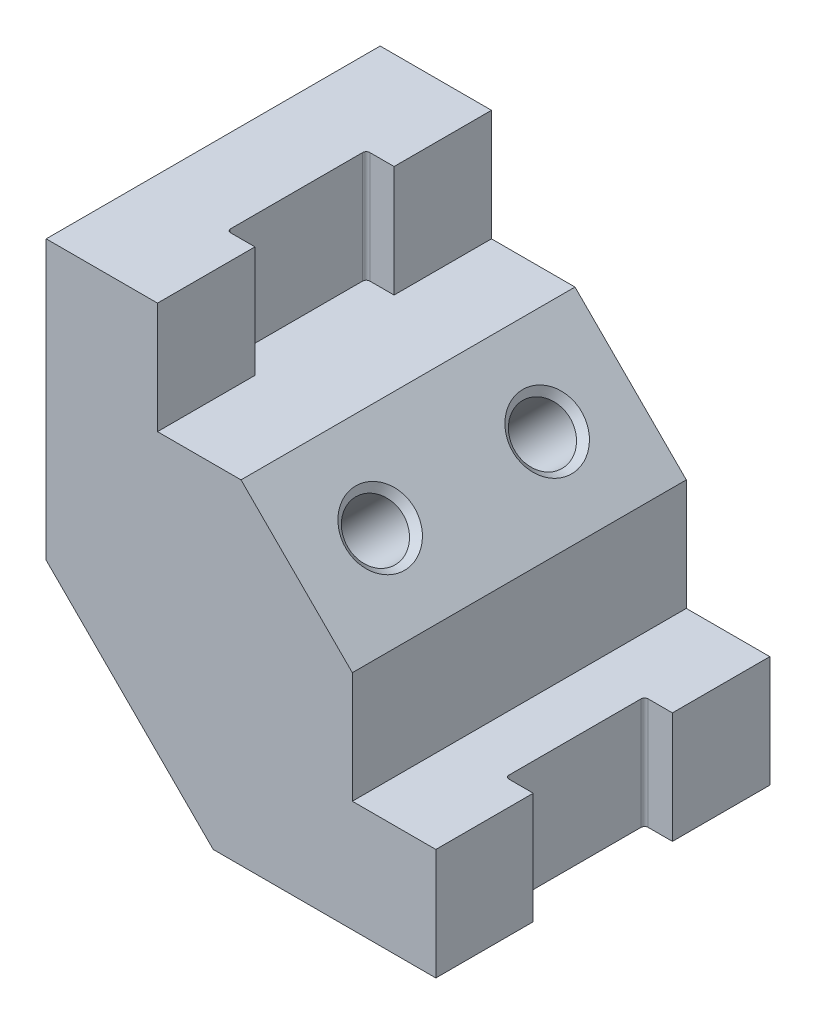
ISO-10303-21;
HEADER;
FILE_DESCRIPTION(('STEP AP214'),'2;1');
FILE_NAME('part.step','',(''),(''),'','','');
FILE_SCHEMA(('AUTOMOTIVE_DESIGN { 1 0 10303 214 1 1 1 1 }'));
ENDSEC;
DATA;
#1=APPLICATION_CONTEXT('core data for automotive mechanical design processes');
#2=APPLICATION_PROTOCOL_DEFINITION('international standard','automotive_design',2000,#1);
#3=PRODUCT_CONTEXT('',#1,'mechanical');
#4=PRODUCT('Part','Part','',(#3));
#5=PRODUCT_RELATED_PRODUCT_CATEGORY('part','',(#4));
#6=PRODUCT_DEFINITION_FORMATION('','',#4);
#7=PRODUCT_DEFINITION_CONTEXT('part definition',#1,'design');
#8=PRODUCT_DEFINITION('design','',#6,#7);
#9=PRODUCT_DEFINITION_SHAPE('','',#8);
#10=(LENGTH_UNIT() NAMED_UNIT(*) SI_UNIT(.MILLI.,.METRE.));
#11=(NAMED_UNIT(*) PLANE_ANGLE_UNIT() SI_UNIT($,.RADIAN.));
#12=(NAMED_UNIT(*) SI_UNIT($,.STERADIAN.) SOLID_ANGLE_UNIT());
#13=UNCERTAINTY_MEASURE_WITH_UNIT(LENGTH_MEASURE(1.E-05),#10,'distance_accuracy_value','');
#14=(GEOMETRIC_REPRESENTATION_CONTEXT(3) GLOBAL_UNCERTAINTY_ASSIGNED_CONTEXT((#13)) GLOBAL_UNIT_ASSIGNED_CONTEXT((#10,
#11,#12)) REPRESENTATION_CONTEXT('',''));
#15=CARTESIAN_POINT('',(0.,0.,0.));
#16=DIRECTION('',(0.,0.,1.));
#17=DIRECTION('',(1.,0.,0.));
#18=AXIS2_PLACEMENT_3D('',#15,#16,#17);
#19=CARTESIAN_POINT('',(26.3327683615819,-52.5937853107344,-76.2));
#20=DIRECTION('',(1.,0.,0.));
#21=DIRECTION('',(0.,0.,-1.));
#22=AXIS2_PLACEMENT_3D('',#19,#20,#21);
#23=PLANE('',#22);
#24=DIRECTION('',(0.,1.,0.));
#25=VECTOR('',#24,1.);
#26=CARTESIAN_POINT('',(26.3327683615819,-52.5937853107345,-22.225));
#27=LINE('',#26,#25);
#28=CARTESIAN_POINT('',(26.3327683615819,-52.5937853107345,-22.225));
#29=VERTEX_POINT('',#28);
#30=CARTESIAN_POINT('',(26.3327683615819,-27.1937853107344,-22.225));
#31=VERTEX_POINT('',#30);
#32=EDGE_CURVE('E195',#29,#31,#27,.T.);
#33=ORIENTED_EDGE('',*,*,#32,.T.);
#34=DIRECTION('',(0.,0.,1.));
#35=VECTOR('',#34,1.);
#36=CARTESIAN_POINT('',(26.3327683615819,-27.1937853107344,-76.2));
#37=LINE('',#36,#35);
#38=CARTESIAN_POINT('',(26.3327683615819,-27.1937853107344,0.));
#39=VERTEX_POINT('',#38);
#40=EDGE_CURVE('E203',#31,#39,#37,.T.);
#41=ORIENTED_EDGE('',*,*,#40,.T.);
#42=DIRECTION('',(0.,1.,0.));
#43=VECTOR('',#42,1.);
#44=CARTESIAN_POINT('',(26.3327683615819,-52.5937853107344,0.));
#45=LINE('',#44,#43);
#46=CARTESIAN_POINT('',(26.3327683615819,-52.5937853107344,0.));
#47=VERTEX_POINT('',#46);
#48=EDGE_CURVE('E352',#47,#39,#45,.T.);
#49=ORIENTED_EDGE('',*,*,#48,.F.);
#50=DIRECTION('',(0.,0.,1.));
#51=VECTOR('',#50,1.);
#52=CARTESIAN_POINT('',(26.3327683615819,-52.5937853107344,-76.2));
#53=LINE('',#52,#51);
#54=EDGE_CURVE('E204',#29,#47,#53,.T.);
#55=ORIENTED_EDGE('',*,*,#54,.F.);
#56=EDGE_LOOP('',(#33,#41,#49,#55));
#57=FACE_BOUND('',#56,.T.);
#58=ADVANCED_FACE('F33',(#57),#23,.T.);
#59=CARTESIAN_POINT('',(-37.1672316384181,23.6062146892656,-76.2));
#60=DIRECTION('',(1.,0.,0.));
#61=DIRECTION('',(0.,0.,-1.));
#62=AXIS2_PLACEMENT_3D('',#59,#60,#61);
#63=PLANE('',#62);
#64=DIRECTION('',(0.,1.,0.));
#65=VECTOR('',#64,1.);
#66=CARTESIAN_POINT('',(-37.1672316384181,-8.77255922204863,-22.225));
#67=LINE('',#66,#65);
#68=CARTESIAN_POINT('',(-37.1672316384181,23.6062146892656,-22.225));
#69=VERTEX_POINT('',#68);
#70=CARTESIAN_POINT('',(-37.1672316384181,49.0062146892655,-22.225));
#71=VERTEX_POINT('',#70);
#72=EDGE_CURVE('E297',#69,#71,#67,.T.);
#73=ORIENTED_EDGE('',*,*,#72,.T.);
#74=DIRECTION('',(0.,0.,1.));
#75=VECTOR('',#74,1.);
#76=CARTESIAN_POINT('',(-37.1672316384181,49.0062146892655,-76.2));
#77=LINE('',#76,#75);
#78=CARTESIAN_POINT('',(-37.1672316384181,49.0062146892655,0.));
#79=VERTEX_POINT('',#78);
#80=EDGE_CURVE('E371',#71,#79,#77,.T.);
#81=ORIENTED_EDGE('',*,*,#80,.T.);
#82=DIRECTION('',(0.,1.,0.));
#83=VECTOR('',#82,1.);
#84=CARTESIAN_POINT('',(-37.1672316384181,23.6062146892656,0.));
#85=LINE('',#84,#83);
#86=CARTESIAN_POINT('',(-37.1672316384181,23.6062146892656,0.));
#87=VERTEX_POINT('',#86);
#88=EDGE_CURVE('E318',#87,#79,#85,.T.);
#89=ORIENTED_EDGE('',*,*,#88,.F.);
#90=DIRECTION('',(0.,0.,1.));
#91=VECTOR('',#90,1.);
#92=CARTESIAN_POINT('',(-37.1672316384181,23.6062146892656,-76.2));
#93=LINE('',#92,#91);
#94=EDGE_CURVE('E375',#69,#87,#93,.T.);
#95=ORIENTED_EDGE('',*,*,#94,.F.);
#96=EDGE_LOOP('',(#73,#81,#89,#95));
#97=FACE_BOUND('',#96,.T.);
#98=ADVANCED_FACE('F425',(#97),#63,.T.);
#99=CARTESIAN_POINT('',(-37.1672316384181,49.0062146892655,-76.2));
#100=DIRECTION('',(0.,1.,0.));
#101=DIRECTION('',(-1.,0.,0.));
#102=AXIS2_PLACEMENT_3D('',#99,#100,#101);
#103=PLANE('',#102);
#104=DIRECTION('',(1.,0.,0.));
#105=VECTOR('',#104,1.);
#106=CARTESIAN_POINT('',(-37.1672316384181,49.0062146892655,-22.225));
#107=LINE('',#106,#105);
#108=CARTESIAN_POINT('',(-42.7044316384181,49.0062146892656,-22.225));
#109=VERTEX_POINT('',#108);
#110=EDGE_CURVE('E306',#109,#71,#107,.T.);
#111=ORIENTED_EDGE('',*,*,#110,.F.);
#112=CARTESIAN_POINT('',(-42.7044316384181,49.0062146892655,-23.0378));
#113=DIRECTION('',(0.,1.,0.));
#114=DIRECTION('',(-1.,0.,0.));
#115=AXIS2_PLACEMENT_3D('',#112,#113,#114);
#116=CIRCLE('',#115,0.8128);
#117=CARTESIAN_POINT('',(-43.5172316384181,49.0062146892656,-23.0378));
#118=VERTEX_POINT('',#117);
#119=EDGE_CURVE('E231',#109,#118,#116,.F.);
#120=ORIENTED_EDGE('',*,*,#119,.T.);
#121=DIRECTION('',(0.,0.,1.));
#122=VECTOR('',#121,1.);
#123=CARTESIAN_POINT('',(-43.5172316384181,49.0062146892656,-53.975));
#124=LINE('',#123,#122);
#125=CARTESIAN_POINT('',(-43.5172316384181,49.0062146892656,-53.1622));
#126=VERTEX_POINT('',#125);
#127=EDGE_CURVE('E303',#126,#118,#124,.T.);
#128=ORIENTED_EDGE('',*,*,#127,.F.);
#129=CARTESIAN_POINT('',(-42.7044316384181,49.0062146892655,-53.1622));
#130=DIRECTION('',(0.,1.,0.));
#131=DIRECTION('',(-1.,0.,0.));
#132=AXIS2_PLACEMENT_3D('',#129,#130,#131);
#133=CIRCLE('',#132,0.8128);
#134=CARTESIAN_POINT('',(-42.7044316384181,49.0062146892656,-53.975));
#135=VERTEX_POINT('',#134);
#136=EDGE_CURVE('E233',#126,#135,#133,.F.);
#137=ORIENTED_EDGE('',*,*,#136,.T.);
#138=DIRECTION('',(-1.,0.,0.));
#139=VECTOR('',#138,1.);
#140=CARTESIAN_POINT('',(-37.1672316384181,49.0062146892655,-53.975));
#141=LINE('',#140,#139);
#142=CARTESIAN_POINT('',(-37.1672316384181,49.0062146892655,-53.975));
#143=VERTEX_POINT('',#142);
#144=EDGE_CURVE('E242',#143,#135,#141,.T.);
#145=ORIENTED_EDGE('',*,*,#144,.F.);
#146=CARTESIAN_POINT('',(-37.1672316384181,49.0062146892655,-76.2));
#147=VERTEX_POINT('',#146);
#148=EDGE_CURVE('E220',#147,#143,#77,.T.);
#149=ORIENTED_EDGE('',*,*,#148,.F.);
#150=DIRECTION('',(-1.,0.,0.));
#151=VECTOR('',#150,1.);
#152=CARTESIAN_POINT('',(-37.1672316384181,49.0062146892655,-76.2));
#153=LINE('',#152,#151);
#154=CARTESIAN_POINT('',(-62.5672316384181,49.0062146892656,-76.2));
#155=VERTEX_POINT('',#154);
#156=EDGE_CURVE('E314',#147,#155,#153,.T.);
#157=ORIENTED_EDGE('',*,*,#156,.T.);
#158=DIRECTION('',(0.,0.,1.));
#159=VECTOR('',#158,1.);
#160=CARTESIAN_POINT('',(-62.5672316384181,49.0062146892656,-76.2));
#161=LINE('',#160,#159);
#162=CARTESIAN_POINT('',(-62.5672316384181,49.0062146892656,0.));
#163=VERTEX_POINT('',#162);
#164=EDGE_CURVE('E213',#155,#163,#161,.T.);
#165=ORIENTED_EDGE('',*,*,#164,.T.);
#166=DIRECTION('',(-1.,0.,0.));
#167=VECTOR('',#166,1.);
#168=CARTESIAN_POINT('',(-37.1672316384181,49.0062146892655,0.));
#169=LINE('',#168,#167);
#170=EDGE_CURVE('E313',#79,#163,#169,.T.);
#171=ORIENTED_EDGE('',*,*,#170,.F.);
#172=ORIENTED_EDGE('',*,*,#80,.F.);
#173=EDGE_LOOP('',(#111,#120,#128,#137,#145,#149,#157,#165,#171,#172));
#174=FACE_BOUND('',#173,.T.);
#175=ADVANCED_FACE('F406',(#174),#103,.T.);
#176=DIRECTION('',(0.,1.,0.));
#177=VECTOR('',#176,1.);
#178=CARTESIAN_POINT('',(-37.1672316384181,-8.77255922204863,-53.975));
#179=LINE('',#178,#177);
#180=CARTESIAN_POINT('',(-37.1672316384181,23.6062146892656,-53.975));
#181=VERTEX_POINT('',#180);
#182=EDGE_CURVE('E308',#181,#143,#179,.T.);
#183=ORIENTED_EDGE('',*,*,#182,.F.);
#184=CARTESIAN_POINT('',(-37.1672316384181,23.6062146892656,-76.2));
#185=VERTEX_POINT('',#184);
#186=EDGE_CURVE('E372',#185,#181,#93,.T.);
#187=ORIENTED_EDGE('',*,*,#186,.F.);
#188=DIRECTION('',(0.,1.,0.));
#189=VECTOR('',#188,1.);
#190=CARTESIAN_POINT('',(-37.1672316384181,23.6062146892656,-76.2));
#191=LINE('',#190,#189);
#192=EDGE_CURVE('E215',#185,#147,#191,.T.);
#193=ORIENTED_EDGE('',*,*,#192,.T.);
#194=ORIENTED_EDGE('',*,*,#148,.T.);
#195=EDGE_LOOP('',(#183,#187,#193,#194));
#196=FACE_BOUND('',#195,.T.);
#197=ADVANCED_FACE('F413',(#196),#63,.T.);
#198=CARTESIAN_POINT('',(-18.1172316384181,23.6062146892656,-76.2));
#199=DIRECTION('',(0.,1.,0.));
#200=DIRECTION('',(-1.,0.,0.));
#201=AXIS2_PLACEMENT_3D('',#198,#199,#200);
#202=PLANE('',#201);
#203=DIRECTION('',(0.,0.,-1.));
#204=VECTOR('',#203,1.);
#205=CARTESIAN_POINT('',(-43.5172316384181,23.6062146892656,-53.975));
#206=LINE('',#205,#204);
#207=CARTESIAN_POINT('',(-43.5172316384181,23.6062146892656,-23.0378));
#208=VERTEX_POINT('',#207);
#209=CARTESIAN_POINT('',(-43.5172316384181,23.6062146892656,-53.1622));
#210=VERTEX_POINT('',#209);
#211=EDGE_CURVE('E293',#208,#210,#206,.T.);
#212=ORIENTED_EDGE('',*,*,#211,.F.);
#213=CARTESIAN_POINT('',(-42.7044316384181,23.6062146892656,-23.0378));
#214=DIRECTION('',(0.,1.,0.));
#215=DIRECTION('',(-1.,0.,0.));
#216=AXIS2_PLACEMENT_3D('',#213,#214,#215);
#217=CIRCLE('',#216,0.8128);
#218=CARTESIAN_POINT('',(-42.7044316384181,23.6062146892656,-22.225));
#219=VERTEX_POINT('',#218);
#220=EDGE_CURVE('E227',#208,#219,#217,.T.);
#221=ORIENTED_EDGE('',*,*,#220,.T.);
#222=DIRECTION('',(-1.,0.,0.));
#223=VECTOR('',#222,1.);
#224=CARTESIAN_POINT('',(-37.1672316384181,23.6062146892656,-22.225));
#225=LINE('',#224,#223);
#226=EDGE_CURVE('E296',#69,#219,#225,.T.);
#227=ORIENTED_EDGE('',*,*,#226,.F.);
#228=ORIENTED_EDGE('',*,*,#94,.T.);
#229=DIRECTION('',(-1.,0.,0.));
#230=VECTOR('',#229,1.);
#231=CARTESIAN_POINT('',(-18.1172316384181,23.6062146892656,0.));
#232=LINE('',#231,#230);
#233=CARTESIAN_POINT('',(-18.1172316384181,23.6062146892656,0.));
#234=VERTEX_POINT('',#233);
#235=EDGE_CURVE('E364',#234,#87,#232,.T.);
#236=ORIENTED_EDGE('',*,*,#235,.F.);
#237=DIRECTION('',(0.,0.,1.));
#238=VECTOR('',#237,1.);
#239=CARTESIAN_POINT('',(-18.1172316384181,23.6062146892656,-76.2));
#240=LINE('',#239,#238);
#241=CARTESIAN_POINT('',(-18.1172316384181,23.6062146892656,-76.2));
#242=VERTEX_POINT('',#241);
#243=EDGE_CURVE('E376',#242,#234,#240,.T.);
#244=ORIENTED_EDGE('',*,*,#243,.F.);
#245=DIRECTION('',(-1.,0.,0.));
#246=VECTOR('',#245,1.);
#247=CARTESIAN_POINT('',(-18.1172316384181,23.6062146892656,-76.2));
#248=LINE('',#247,#246);
#249=EDGE_CURVE('E336',#242,#185,#248,.T.);
#250=ORIENTED_EDGE('',*,*,#249,.T.);
#251=ORIENTED_EDGE('',*,*,#186,.T.);
#252=DIRECTION('',(1.,0.,0.));
#253=VECTOR('',#252,1.);
#254=CARTESIAN_POINT('',(-37.1672316384181,23.6062146892656,-53.975));
#255=LINE('',#254,#253);
#256=CARTESIAN_POINT('',(-42.7044316384181,23.6062146892656,-53.975));
#257=VERTEX_POINT('',#256);
#258=EDGE_CURVE('E300',#257,#181,#255,.T.);
#259=ORIENTED_EDGE('',*,*,#258,.F.);
#260=CARTESIAN_POINT('',(-42.7044316384181,23.6062146892656,-53.1622));
#261=DIRECTION('',(0.,1.,0.));
#262=DIRECTION('',(-1.,0.,0.));
#263=AXIS2_PLACEMENT_3D('',#260,#261,#262);
#264=CIRCLE('',#263,0.8128);
#265=EDGE_CURVE('E225',#257,#210,#264,.T.);
#266=ORIENTED_EDGE('',*,*,#265,.T.);
#267=EDGE_LOOP('',(#212,#221,#227,#228,#236,#244,#250,#251,#259,#266));
#268=FACE_BOUND('',#267,.T.);
#269=ADVANCED_FACE('F417',(#268),#202,.T.);
#270=CARTESIAN_POINT('',(7.28276836158218,-1.79378531073444,-76.2));
#271=DIRECTION('',(0.707106781186544,0.707106781186551,0.));
#272=DIRECTION('',(-0.707106781186551,0.707106781186544,0.));
#273=AXIS2_PLACEMENT_3D('',#270,#271,#272);
#274=PLANE('',#273);
#275=CARTESIAN_POINT('',(-5.41531379360967,10.9042968444573,-57.15));
#276=DIRECTION('',(0.707106781186544,0.707106781186551,0.));
#277=DIRECTION('',(-0.707106781186551,0.707106781186544,0.));
#278=AXIS2_PLACEMENT_3D('',#275,#276,#277);
#279=CIRCLE('',#278,7.87400000000004);
#280=CARTESIAN_POINT('',(-10.9830725886726,16.4720556395201,-57.15));
#281=VERTEX_POINT('',#280);
#282=EDGE_CURVE('E248',#281,#281,#279,.F.);
#283=ORIENTED_EDGE('',*,*,#282,.T.);
#284=EDGE_LOOP('',(#283));
#285=FACE_BOUND('',#284,.T.);
#286=CARTESIAN_POINT('',(-5.41531379360948,10.9042968444571,-19.05));
#287=DIRECTION('',(0.707106781186544,0.707106781186551,0.));
#288=DIRECTION('',(-0.707106781186551,0.707106781186544,0.));
#289=AXIS2_PLACEMENT_3D('',#286,#287,#288);
#290=CIRCLE('',#289,7.87400000000005);
#291=CARTESIAN_POINT('',(-10.9830725886724,16.47205563952,-19.05));
#292=VERTEX_POINT('',#291);
#293=EDGE_CURVE('E245',#292,#292,#290,.F.);
#294=ORIENTED_EDGE('',*,*,#293,.T.);
#295=EDGE_LOOP('',(#294));
#296=FACE_BOUND('',#295,.T.);
#297=DIRECTION('',(-0.707106781186552,0.707106781186544,0.));
#298=VECTOR('',#297,1.);
#299=CARTESIAN_POINT('',(7.28276836158218,-1.79378531073444,0.));
#300=LINE('',#299,#298);
#301=CARTESIAN_POINT('',(7.28276836158218,-1.79378531073444,0.));
#302=VERTEX_POINT('',#301);
#303=EDGE_CURVE('E361',#302,#234,#300,.T.);
#304=ORIENTED_EDGE('',*,*,#303,.F.);
#305=DIRECTION('',(0.,0.,1.));
#306=VECTOR('',#305,1.);
#307=CARTESIAN_POINT('',(7.28276836158218,-1.79378531073444,-76.2));
#308=LINE('',#307,#306);
#309=CARTESIAN_POINT('',(7.28276836158218,-1.79378531073444,-76.2));
#310=VERTEX_POINT('',#309);
#311=EDGE_CURVE('E378',#310,#302,#308,.T.);
#312=ORIENTED_EDGE('',*,*,#311,.F.);
#313=DIRECTION('',(-0.707106781186552,0.707106781186544,0.));
#314=VECTOR('',#313,1.);
#315=CARTESIAN_POINT('',(7.28276836158218,-1.79378531073444,-76.2));
#316=LINE('',#315,#314);
#317=EDGE_CURVE('E333',#310,#242,#316,.T.);
#318=ORIENTED_EDGE('',*,*,#317,.T.);
#319=ORIENTED_EDGE('',*,*,#243,.T.);
#320=EDGE_LOOP('',(#304,#312,#318,#319));
#321=FACE_BOUND('',#320,.T.);
#322=ADVANCED_FACE('F421',(#285,#296,#321),#274,.T.);
#323=CARTESIAN_POINT('',(7.28276836158218,-27.1937853107344,-76.2));
#324=DIRECTION('',(1.,0.,0.));
#325=DIRECTION('',(0.,1.,0.));
#326=AXIS2_PLACEMENT_3D('',#323,#324,#325);
#327=PLANE('',#326);
#328=DIRECTION('',(0.,1.,0.));
#329=VECTOR('',#328,1.);
#330=CARTESIAN_POINT('',(7.28276836158218,-27.1937853107344,0.));
#331=LINE('',#330,#329);
#332=CARTESIAN_POINT('',(7.28276836158218,-27.1937853107344,0.));
#333=VERTEX_POINT('',#332);
#334=EDGE_CURVE('E358',#333,#302,#331,.T.);
#335=ORIENTED_EDGE('',*,*,#334,.F.);
#336=DIRECTION('',(0.,0.,1.));
#337=VECTOR('',#336,1.);
#338=CARTESIAN_POINT('',(7.28276836158218,-27.1937853107344,-76.2));
#339=LINE('',#338,#337);
#340=CARTESIAN_POINT('',(7.28276836158218,-27.1937853107344,-76.2));
#341=VERTEX_POINT('',#340);
#342=EDGE_CURVE('E379',#341,#333,#339,.T.);
#343=ORIENTED_EDGE('',*,*,#342,.F.);
#344=DIRECTION('',(0.,1.,0.));
#345=VECTOR('',#344,1.);
#346=CARTESIAN_POINT('',(7.28276836158218,-27.1937853107344,-76.2));
#347=LINE('',#346,#345);
#348=EDGE_CURVE('E330',#341,#310,#347,.T.);
#349=ORIENTED_EDGE('',*,*,#348,.T.);
#350=ORIENTED_EDGE('',*,*,#311,.T.);
#351=EDGE_LOOP('',(#335,#343,#349,#350));
#352=FACE_BOUND('',#351,.T.);
#353=ADVANCED_FACE('F385',(#352),#327,.T.);
#354=CARTESIAN_POINT('',(26.3327683615819,-27.1937853107344,-76.2));
#355=DIRECTION('',(0.,1.,0.));
#356=DIRECTION('',(-1.,0.,0.));
#357=AXIS2_PLACEMENT_3D('',#354,#355,#356);
#358=PLANE('',#357);
#359=DIRECTION('',(1.,0.,0.));
#360=VECTOR('',#359,1.);
#361=CARTESIAN_POINT('',(26.3327683615819,-27.1937853107344,-22.225));
#362=LINE('',#361,#360);
#363=CARTESIAN_POINT('',(20.7955683615819,-27.1937853107344,-22.225));
#364=VERTEX_POINT('',#363);
#365=EDGE_CURVE('E186',#364,#31,#362,.T.);
#366=ORIENTED_EDGE('',*,*,#365,.F.);
#367=CARTESIAN_POINT('',(20.7955683615819,-27.1937853107344,-23.0378));
#368=DIRECTION('',(0.,1.,0.));
#369=DIRECTION('',(-1.,0.,0.));
#370=AXIS2_PLACEMENT_3D('',#367,#368,#369);
#371=CIRCLE('',#370,0.8128);
#372=CARTESIAN_POINT('',(19.9827683615819,-27.1937853107344,-23.0378));
#373=VERTEX_POINT('',#372);
#374=EDGE_CURVE('E263',#364,#373,#371,.F.);
#375=ORIENTED_EDGE('',*,*,#374,.T.);
#376=DIRECTION('',(0.,0.,1.));
#377=VECTOR('',#376,1.);
#378=CARTESIAN_POINT('',(19.9827683615819,-27.1937853107344,-53.975));
#379=LINE('',#378,#377);
#380=CARTESIAN_POINT('',(19.9827683615819,-27.1937853107344,-53.1622));
#381=VERTEX_POINT('',#380);
#382=EDGE_CURVE('E282',#381,#373,#379,.T.);
#383=ORIENTED_EDGE('',*,*,#382,.F.);
#384=CARTESIAN_POINT('',(20.7955683615819,-27.1937853107344,-53.1622));
#385=DIRECTION('',(0.,1.,0.));
#386=DIRECTION('',(-1.,0.,0.));
#387=AXIS2_PLACEMENT_3D('',#384,#385,#386);
#388=CIRCLE('',#387,0.8128);
#389=CARTESIAN_POINT('',(20.7955683615819,-27.1937853107344,-53.975));
#390=VERTEX_POINT('',#389);
#391=EDGE_CURVE('E41',#381,#390,#388,.F.);
#392=ORIENTED_EDGE('',*,*,#391,.T.);
#393=DIRECTION('',(-1.,0.,0.));
#394=VECTOR('',#393,1.);
#395=CARTESIAN_POINT('',(26.3327683615819,-27.1937853107344,-53.975));
#396=LINE('',#395,#394);
#397=CARTESIAN_POINT('',(26.3327683615819,-27.1937853107344,-53.975));
#398=VERTEX_POINT('',#397);
#399=EDGE_CURVE('E287',#398,#390,#396,.T.);
#400=ORIENTED_EDGE('',*,*,#399,.F.);
#401=CARTESIAN_POINT('',(26.3327683615819,-27.1937853107344,-76.2));
#402=VERTEX_POINT('',#401);
#403=EDGE_CURVE('E194',#402,#398,#37,.T.);
#404=ORIENTED_EDGE('',*,*,#403,.F.);
#405=DIRECTION('',(-1.,0.,0.));
#406=VECTOR('',#405,1.);
#407=CARTESIAN_POINT('',(26.3327683615819,-27.1937853107344,-76.2));
#408=LINE('',#407,#406);
#409=EDGE_CURVE('E327',#402,#341,#408,.T.);
#410=ORIENTED_EDGE('',*,*,#409,.T.);
#411=ORIENTED_EDGE('',*,*,#342,.T.);
#412=DIRECTION('',(-1.,0.,0.));
#413=VECTOR('',#412,1.);
#414=CARTESIAN_POINT('',(26.3327683615819,-27.1937853107344,0.));
#415=LINE('',#414,#413);
#416=EDGE_CURVE('E355',#39,#333,#415,.T.);
#417=ORIENTED_EDGE('',*,*,#416,.F.);
#418=ORIENTED_EDGE('',*,*,#40,.F.);
#419=EDGE_LOOP('',(#366,#375,#383,#392,#400,#404,#410,#411,#417,#418));
#420=FACE_BOUND('',#419,.T.);
#421=ADVANCED_FACE('F281',(#420),#358,.T.);
#422=DIRECTION('',(0.,1.,0.));
#423=VECTOR('',#422,1.);
#424=CARTESIAN_POINT('',(26.3327683615819,-52.5937853107345,-53.975));
#425=LINE('',#424,#423);
#426=CARTESIAN_POINT('',(26.3327683615819,-52.5937853107345,-53.975));
#427=VERTEX_POINT('',#426);
#428=EDGE_CURVE('E181',#427,#398,#425,.T.);
#429=ORIENTED_EDGE('',*,*,#428,.F.);
#430=CARTESIAN_POINT('',(26.3327683615819,-52.5937853107344,-76.2));
#431=VERTEX_POINT('',#430);
#432=EDGE_CURVE('E192',#431,#427,#53,.T.);
#433=ORIENTED_EDGE('',*,*,#432,.F.);
#434=DIRECTION('',(0.,1.,0.));
#435=VECTOR('',#434,1.);
#436=CARTESIAN_POINT('',(26.3327683615819,-52.5937853107344,-76.2));
#437=LINE('',#436,#435);
#438=EDGE_CURVE('E325',#431,#402,#437,.T.);
#439=ORIENTED_EDGE('',*,*,#438,.T.);
#440=ORIENTED_EDGE('',*,*,#403,.T.);
#441=EDGE_LOOP('',(#429,#433,#439,#440));
#442=FACE_BOUND('',#441,.T.);
#443=ADVANCED_FACE('F190',(#442),#23,.T.);
#444=CARTESIAN_POINT('',(-24.4672316384181,-52.5937853107344,-76.2));
#445=DIRECTION('',(0.,-1.,0.));
#446=DIRECTION('',(1.,0.,0.));
#447=AXIS2_PLACEMENT_3D('',#444,#445,#446);
#448=PLANE('',#447);
#449=DIRECTION('',(0.,0.,1.));
#450=VECTOR('',#449,1.);
#451=CARTESIAN_POINT('',(19.9827683615819,-52.5937853107345,-53.975));
#452=LINE('',#451,#450);
#453=CARTESIAN_POINT('',(19.9827683615819,-52.5937853107345,-53.1622));
#454=VERTEX_POINT('',#453);
#455=CARTESIAN_POINT('',(19.9827683615819,-52.5937853107345,-23.0378));
#456=VERTEX_POINT('',#455);
#457=EDGE_CURVE('E185',#454,#456,#452,.T.);
#458=ORIENTED_EDGE('',*,*,#457,.T.);
#459=CARTESIAN_POINT('',(20.7955683615819,-52.5937853107344,-23.0378));
#460=DIRECTION('',(0.,-1.,0.));
#461=DIRECTION('',(1.,0.,0.));
#462=AXIS2_PLACEMENT_3D('',#459,#460,#461);
#463=CIRCLE('',#462,0.8128);
#464=CARTESIAN_POINT('',(20.7955683615819,-52.5937853107345,-22.225));
#465=VERTEX_POINT('',#464);
#466=EDGE_CURVE('E265',#456,#465,#463,.F.);
#467=ORIENTED_EDGE('',*,*,#466,.T.);
#468=DIRECTION('',(1.,0.,0.));
#469=VECTOR('',#468,1.);
#470=CARTESIAN_POINT('',(26.3327683615819,-52.5937853107345,-22.225));
#471=LINE('',#470,#469);
#472=EDGE_CURVE('E196',#465,#29,#471,.T.);
#473=ORIENTED_EDGE('',*,*,#472,.T.);
#474=ORIENTED_EDGE('',*,*,#54,.T.);
#475=DIRECTION('',(1.,0.,0.));
#476=VECTOR('',#475,1.);
#477=CARTESIAN_POINT('',(-24.4672316384181,-52.5937853107344,0.));
#478=LINE('',#477,#476);
#479=CARTESIAN_POINT('',(-24.4672316384181,-52.5937853107344,0.));
#480=VERTEX_POINT('',#479);
#481=EDGE_CURVE('E349',#480,#47,#478,.T.);
#482=ORIENTED_EDGE('',*,*,#481,.F.);
#483=DIRECTION('',(0.,0.,1.));
#484=VECTOR('',#483,1.);
#485=CARTESIAN_POINT('',(-24.4672316384181,-52.5937853107344,-76.2));
#486=LINE('',#485,#484);
#487=CARTESIAN_POINT('',(-24.4672316384181,-52.5937853107344,-76.2));
#488=VERTEX_POINT('',#487);
#489=EDGE_CURVE('E207',#488,#480,#486,.T.);
#490=ORIENTED_EDGE('',*,*,#489,.F.);
#491=DIRECTION('',(1.,0.,0.));
#492=VECTOR('',#491,1.);
#493=CARTESIAN_POINT('',(-24.4672316384181,-52.5937853107344,-76.2));
#494=LINE('',#493,#492);
#495=EDGE_CURVE('E202',#488,#431,#494,.T.);
#496=ORIENTED_EDGE('',*,*,#495,.T.);
#497=ORIENTED_EDGE('',*,*,#432,.T.);
#498=DIRECTION('',(-1.,0.,0.));
#499=VECTOR('',#498,1.);
#500=CARTESIAN_POINT('',(26.3327683615819,-52.5937853107345,-53.975));
#501=LINE('',#500,#499);
#502=CARTESIAN_POINT('',(20.7955683615819,-52.5937853107345,-53.975));
#503=VERTEX_POINT('',#502);
#504=EDGE_CURVE('E178',#427,#503,#501,.T.);
#505=ORIENTED_EDGE('',*,*,#504,.T.);
#506=CARTESIAN_POINT('',(20.7955683615819,-52.5937853107344,-53.1622));
#507=DIRECTION('',(0.,-1.,0.));
#508=DIRECTION('',(1.,0.,0.));
#509=AXIS2_PLACEMENT_3D('',#506,#507,#508);
#510=CIRCLE('',#509,0.8128);
#511=EDGE_CURVE('E11',#503,#454,#510,.F.);
#512=ORIENTED_EDGE('',*,*,#511,.T.);
#513=EDGE_LOOP('',(#458,#467,#473,#474,#482,#490,#496,#497,#505,#512));
#514=FACE_BOUND('',#513,.T.);
#515=ADVANCED_FACE('F200',(#514),#448,.T.);
#516=CARTESIAN_POINT('',(-24.4672316384181,-52.5937853107344,-76.2));
#517=DIRECTION('',(-0.707106781186543,-0.707106781186552,0.));
#518=DIRECTION('',(0.707106781186552,-0.707106781186543,0.));
#519=AXIS2_PLACEMENT_3D('',#516,#517,#518);
#520=PLANE('',#519);
#521=CARTESIAN_POINT('',(-46.6903137936095,-30.3707031555433,-19.05));
#522=DIRECTION('',(-0.707106781186543,-0.707106781186552,0.));
#523=DIRECTION('',(0.707106781186552,-0.707106781186543,0.));
#524=AXIS2_PLACEMENT_3D('',#521,#522,#523);
#525=CIRCLE('',#524,6.35);
#526=CARTESIAN_POINT('',(-42.2001857330748,-34.8608312160779,-19.05));
#527=VERTEX_POINT('',#526);
#528=EDGE_CURVE('E239',#527,#527,#525,.T.);
#529=ORIENTED_EDGE('',*,*,#528,.F.);
#530=EDGE_LOOP('',(#529));
#531=FACE_BOUND('',#530,.T.);
#532=CARTESIAN_POINT('',(-46.6903137936096,-30.3707031555432,-57.15));
#533=DIRECTION('',(-0.707106781186543,-0.707106781186552,0.));
#534=DIRECTION('',(0.707106781186552,-0.707106781186543,0.));
#535=AXIS2_PLACEMENT_3D('',#532,#533,#534);
#536=CIRCLE('',#535,6.35);
#537=CARTESIAN_POINT('',(-42.200185733075,-34.8608312160777,-57.15));
#538=VERTEX_POINT('',#537);
#539=EDGE_CURVE('E236',#538,#538,#536,.T.);
#540=ORIENTED_EDGE('',*,*,#539,.F.);
#541=EDGE_LOOP('',(#540));
#542=FACE_BOUND('',#541,.T.);
#543=DIRECTION('',(0.707106781186552,-0.707106781186543,0.));
#544=VECTOR('',#543,1.);
#545=CARTESIAN_POINT('',(-24.4672316384181,-52.5937853107344,0.));
#546=LINE('',#545,#544);
#547=CARTESIAN_POINT('',(-62.5672316384181,-14.4937853107349,0.));
#548=VERTEX_POINT('',#547);
#549=EDGE_CURVE('E346',#548,#480,#546,.T.);
#550=ORIENTED_EDGE('',*,*,#549,.F.);
#551=DIRECTION('',(0.,0.,1.));
#552=VECTOR('',#551,1.);
#553=CARTESIAN_POINT('',(-62.5672316384181,-14.4937853107349,-76.2));
#554=LINE('',#553,#552);
#555=CARTESIAN_POINT('',(-62.5672316384181,-14.4937853107349,-76.2));
#556=VERTEX_POINT('',#555);
#557=EDGE_CURVE('E211',#556,#548,#554,.T.);
#558=ORIENTED_EDGE('',*,*,#557,.F.);
#559=DIRECTION('',(0.707106781186552,-0.707106781186543,0.));
#560=VECTOR('',#559,1.);
#561=CARTESIAN_POINT('',(-24.4672316384181,-52.5937853107344,-76.2));
#562=LINE('',#561,#560);
#563=EDGE_CURVE('E321',#556,#488,#562,.T.);
#564=ORIENTED_EDGE('',*,*,#563,.T.);
#565=ORIENTED_EDGE('',*,*,#489,.T.);
#566=EDGE_LOOP('',(#550,#558,#564,#565));
#567=FACE_BOUND('',#566,.T.);
#568=ADVANCED_FACE('F395',(#531,#542,#567),#520,.T.);
#569=CARTESIAN_POINT('',(-62.5672316384181,49.0062146892656,-76.2));
#570=DIRECTION('',(-1.,0.,0.));
#571=DIRECTION('',(0.,0.,1.));
#572=AXIS2_PLACEMENT_3D('',#569,#570,#571);
#573=PLANE('',#572);
#574=DIRECTION('',(0.,-1.,0.));
#575=VECTOR('',#574,1.);
#576=CARTESIAN_POINT('',(-62.5672316384181,49.0062146892656,0.));
#577=LINE('',#576,#575);
#578=EDGE_CURVE('E343',#163,#548,#577,.T.);
#579=ORIENTED_EDGE('',*,*,#578,.F.);
#580=ORIENTED_EDGE('',*,*,#164,.F.);
#581=DIRECTION('',(0.,-1.,0.));
#582=VECTOR('',#581,1.);
#583=CARTESIAN_POINT('',(-62.5672316384181,49.0062146892656,-76.2));
#584=LINE('',#583,#582);
#585=EDGE_CURVE('E317',#155,#556,#584,.T.);
#586=ORIENTED_EDGE('',*,*,#585,.T.);
#587=ORIENTED_EDGE('',*,*,#557,.T.);
#588=EDGE_LOOP('',(#579,#580,#586,#587));
#589=FACE_BOUND('',#588,.T.);
#590=ADVANCED_FACE('F402',(#589),#573,.T.);
#591=CARTESIAN_POINT('',(0.,0.,-76.2));
#592=DIRECTION('',(0.,0.,1.));
#593=DIRECTION('',(1.,0.,0.));
#594=AXIS2_PLACEMENT_3D('',#591,#592,#593);
#595=PLANE('',#594);
#596=ORIENTED_EDGE('',*,*,#156,.F.);
#597=ORIENTED_EDGE('',*,*,#192,.F.);
#598=ORIENTED_EDGE('',*,*,#249,.F.);
#599=ORIENTED_EDGE('',*,*,#317,.F.);
#600=ORIENTED_EDGE('',*,*,#348,.F.);
#601=ORIENTED_EDGE('',*,*,#409,.F.);
#602=ORIENTED_EDGE('',*,*,#438,.F.);
#603=ORIENTED_EDGE('',*,*,#495,.F.);
#604=ORIENTED_EDGE('',*,*,#563,.F.);
#605=ORIENTED_EDGE('',*,*,#585,.F.);
#606=EDGE_LOOP('',(#596,#597,#598,#599,#600,#601,#602,#603,#604,#605));
#607=FACE_BOUND('',#606,.T.);
#608=ADVANCED_FACE('F400',(#607),#595,.F.);
#609=CARTESIAN_POINT('',(0.,0.,0.));
#610=DIRECTION('',(0.,0.,1.));
#611=DIRECTION('',(1.,0.,0.));
#612=AXIS2_PLACEMENT_3D('',#609,#610,#611);
#613=PLANE('',#612);
#614=ORIENTED_EDGE('',*,*,#170,.T.);
#615=ORIENTED_EDGE('',*,*,#578,.T.);
#616=ORIENTED_EDGE('',*,*,#549,.T.);
#617=ORIENTED_EDGE('',*,*,#481,.T.);
#618=ORIENTED_EDGE('',*,*,#48,.T.);
#619=ORIENTED_EDGE('',*,*,#416,.T.);
#620=ORIENTED_EDGE('',*,*,#334,.T.);
#621=ORIENTED_EDGE('',*,*,#303,.T.);
#622=ORIENTED_EDGE('',*,*,#235,.T.);
#623=ORIENTED_EDGE('',*,*,#88,.T.);
#624=EDGE_LOOP('',(#614,#615,#616,#617,#618,#619,#620,#621,#622,#623));
#625=FACE_BOUND('',#624,.T.);
#626=ADVANCED_FACE('F388',(#625),#613,.T.);
#627=CARTESIAN_POINT('',(-37.1672316384181,-8.77255922204863,-22.225));
#628=DIRECTION('',(0.,0.,1.));
#629=DIRECTION('',(1.,0.,0.));
#630=AXIS2_PLACEMENT_3D('',#627,#628,#629);
#631=PLANE('',#630);
#632=ORIENTED_EDGE('',*,*,#226,.T.);
#633=DIRECTION('',(0.,1.,0.));
#634=VECTOR('',#633,1.);
#635=CARTESIAN_POINT('',(-42.7044316384181,49.0062146892656,-22.225));
#636=LINE('',#635,#634);
#637=EDGE_CURVE('E216',#219,#109,#636,.T.);
#638=ORIENTED_EDGE('',*,*,#637,.T.);
#639=ORIENTED_EDGE('',*,*,#110,.T.);
#640=ORIENTED_EDGE('',*,*,#72,.F.);
#641=EDGE_LOOP('',(#632,#638,#639,#640));
#642=FACE_BOUND('',#641,.T.);
#643=ADVANCED_FACE('F428',(#642),#631,.F.);
#644=CARTESIAN_POINT('',(-43.5172316384181,-8.77255922204863,-53.975));
#645=DIRECTION('',(-1.,0.,0.));
#646=DIRECTION('',(0.,0.,1.));
#647=AXIS2_PLACEMENT_3D('',#644,#645,#646);
#648=PLANE('',#647);
#649=ORIENTED_EDGE('',*,*,#127,.T.);
#650=DIRECTION('',(0.,1.,0.));
#651=VECTOR('',#650,1.);
#652=CARTESIAN_POINT('',(-43.5172316384181,23.6062146892656,-23.0378));
#653=LINE('',#652,#651);
#654=EDGE_CURVE('E223',#118,#208,#653,.F.);
#655=ORIENTED_EDGE('',*,*,#654,.T.);
#656=ORIENTED_EDGE('',*,*,#211,.T.);
#657=DIRECTION('',(0.,1.,0.));
#658=VECTOR('',#657,1.);
#659=CARTESIAN_POINT('',(-43.5172316384181,49.0062146892656,-53.1622));
#660=LINE('',#659,#658);
#661=EDGE_CURVE('E219',#210,#126,#660,.T.);
#662=ORIENTED_EDGE('',*,*,#661,.T.);
#663=EDGE_LOOP('',(#649,#655,#656,#662));
#664=FACE_BOUND('',#663,.T.);
#665=ADVANCED_FACE('F436',(#664),#648,.F.);
#666=CARTESIAN_POINT('',(-37.1672316384181,-8.77255922204863,-53.975));
#667=DIRECTION('',(0.,0.,-1.));
#668=DIRECTION('',(-1.,0.,0.));
#669=AXIS2_PLACEMENT_3D('',#666,#667,#668);
#670=PLANE('',#669);
#671=ORIENTED_EDGE('',*,*,#144,.T.);
#672=DIRECTION('',(0.,1.,0.));
#673=VECTOR('',#672,1.);
#674=CARTESIAN_POINT('',(-42.7044316384181,23.6062146892656,-53.975));
#675=LINE('',#674,#673);
#676=EDGE_CURVE('E229',#135,#257,#675,.F.);
#677=ORIENTED_EDGE('',*,*,#676,.T.);
#678=ORIENTED_EDGE('',*,*,#258,.T.);
#679=ORIENTED_EDGE('',*,*,#182,.T.);
#680=EDGE_LOOP('',(#671,#677,#678,#679));
#681=FACE_BOUND('',#680,.T.);
#682=ADVANCED_FACE('F443',(#681),#670,.F.);
#683=CARTESIAN_POINT('',(-42.7044316384181,-8.77255922204863,-23.0378));
#684=DIRECTION('',(0.,-1.,0.));
#685=DIRECTION('',(1.,0.,0.));
#686=AXIS2_PLACEMENT_3D('',#683,#684,#685);
#687=CYLINDRICAL_SURFACE('',#686,0.8128);
#688=ORIENTED_EDGE('',*,*,#220,.F.);
#689=ORIENTED_EDGE('',*,*,#654,.F.);
#690=ORIENTED_EDGE('',*,*,#119,.F.);
#691=ORIENTED_EDGE('',*,*,#637,.F.);
#692=EDGE_LOOP('',(#688,#689,#690,#691));
#693=FACE_BOUND('',#692,.T.);
#694=ADVANCED_FACE('F433',(#693),#687,.F.);
#695=CARTESIAN_POINT('',(-42.7044316384181,-8.77255922204863,-53.1622));
#696=DIRECTION('',(0.,-1.,0.));
#697=DIRECTION('',(1.,0.,0.));
#698=AXIS2_PLACEMENT_3D('',#695,#696,#697);
#699=CYLINDRICAL_SURFACE('',#698,0.8128);
#700=ORIENTED_EDGE('',*,*,#265,.F.);
#701=ORIENTED_EDGE('',*,*,#676,.F.);
#702=ORIENTED_EDGE('',*,*,#136,.F.);
#703=ORIENTED_EDGE('',*,*,#661,.F.);
#704=EDGE_LOOP('',(#700,#701,#702,#703));
#705=FACE_BOUND('',#704,.T.);
#706=ADVANCED_FACE('F441',(#705),#699,.F.);
#707=CARTESIAN_POINT('',(-59.2968505200243,-42.9772398819579,-57.15));
#708=DIRECTION('',(0.707106781186544,0.707106781186551,0.));
#709=DIRECTION('',(-0.707106781186551,0.707106781186544,0.));
#710=AXIS2_PLACEMENT_3D('',#707,#708,#709);
#711=CYLINDRICAL_SURFACE('',#710,6.35);
#712=CARTESIAN_POINT('',(-6.492944528138,9.82666610992894,-57.15));
#713=DIRECTION('',(0.707106781186543,0.707106781186552,0.));
#714=DIRECTION('',(-0.707106781186552,0.707106781186543,0.));
#715=AXIS2_PLACEMENT_3D('',#712,#713,#714);
#716=CIRCLE('',#715,6.35);
#717=CARTESIAN_POINT('',(-10.9830725886726,14.3167941704635,-57.15));
#718=VERTEX_POINT('',#717);
#719=EDGE_CURVE('E235',#718,#718,#716,.T.);
#720=ORIENTED_EDGE('',*,*,#719,.T.);
#721=EDGE_LOOP('',(#720));
#722=FACE_BOUND('',#721,.T.);
#723=ORIENTED_EDGE('',*,*,#539,.T.);
#724=EDGE_LOOP('',(#723));
#725=FACE_BOUND('',#724,.T.);
#726=ADVANCED_FACE('F493',(#722,#725),#711,.F.);
#727=CARTESIAN_POINT('',(-59.2968505200241,-42.9772398819581,-19.05));
#728=DIRECTION('',(0.707106781186544,0.707106781186551,0.));
#729=DIRECTION('',(-0.707106781186551,0.707106781186544,0.));
#730=AXIS2_PLACEMENT_3D('',#727,#728,#729);
#731=CYLINDRICAL_SURFACE('',#730,6.35);
#732=CARTESIAN_POINT('',(-6.49294452813777,9.82666610992878,-19.05));
#733=DIRECTION('',(0.707106781186541,0.707106781186554,0.));
#734=DIRECTION('',(-0.707106781186554,0.707106781186541,0.));
#735=AXIS2_PLACEMENT_3D('',#732,#733,#734);
#736=CIRCLE('',#735,6.35);
#737=CARTESIAN_POINT('',(-10.9830725886724,14.3167941704633,-19.05));
#738=VERTEX_POINT('',#737);
#739=EDGE_CURVE('E251',#738,#738,#736,.T.);
#740=ORIENTED_EDGE('',*,*,#739,.T.);
#741=EDGE_LOOP('',(#740));
#742=FACE_BOUND('',#741,.T.);
#743=ORIENTED_EDGE('',*,*,#528,.T.);
#744=EDGE_LOOP('',(#743));
#745=FACE_BOUND('',#744,.T.);
#746=ADVANCED_FACE('F498',(#742,#745),#731,.F.);
#747=CARTESIAN_POINT('',(-6.492944528138,9.82666610992894,-57.15));
#748=DIRECTION('',(0.707106781186543,0.707106781186552,0.));
#749=DIRECTION('',(-0.707106781186552,0.707106781186543,0.));
#750=AXIS2_PLACEMENT_3D('',#747,#748,#749);
#751=CONICAL_SURFACE('',#750,6.35,0.785398163397444);
#752=ORIENTED_EDGE('',*,*,#282,.F.);
#753=EDGE_LOOP('',(#752));
#754=FACE_BOUND('',#753,.T.);
#755=ORIENTED_EDGE('',*,*,#719,.F.);
#756=EDGE_LOOP('',(#755));
#757=FACE_BOUND('',#756,.T.);
#758=ADVANCED_FACE('F494',(#754,#757),#751,.F.);
#759=CARTESIAN_POINT('',(-6.49294452813777,9.82666610992878,-19.05));
#760=DIRECTION('',(0.707106781186541,0.707106781186554,0.));
#761=DIRECTION('',(-0.707106781186554,0.707106781186541,0.));
#762=AXIS2_PLACEMENT_3D('',#759,#760,#761);
#763=CONICAL_SURFACE('',#762,6.35,0.785398163397452);
#764=ORIENTED_EDGE('',*,*,#293,.F.);
#765=EDGE_LOOP('',(#764));
#766=FACE_BOUND('',#765,.T.);
#767=ORIENTED_EDGE('',*,*,#739,.F.);
#768=EDGE_LOOP('',(#767));
#769=FACE_BOUND('',#768,.T.);
#770=ADVANCED_FACE('F497',(#766,#769),#763,.F.);
#771=CARTESIAN_POINT('',(26.3327683615819,-52.5937853107345,-22.225));
#772=DIRECTION('',(0.,0.,1.));
#773=DIRECTION('',(1.,0.,0.));
#774=AXIS2_PLACEMENT_3D('',#771,#772,#773);
#775=PLANE('',#774);
#776=ORIENTED_EDGE('',*,*,#472,.F.);
#777=DIRECTION('',(0.,1.,0.));
#778=VECTOR('',#777,1.);
#779=CARTESIAN_POINT('',(20.7955683615819,-27.1937853107344,-22.225));
#780=LINE('',#779,#778);
#781=EDGE_CURVE('E254',#465,#364,#780,.T.);
#782=ORIENTED_EDGE('',*,*,#781,.T.);
#783=ORIENTED_EDGE('',*,*,#365,.T.);
#784=ORIENTED_EDGE('',*,*,#32,.F.);
#785=EDGE_LOOP('',(#776,#782,#783,#784));
#786=FACE_BOUND('',#785,.T.);
#787=ADVANCED_FACE('F274',(#786),#775,.F.);
#788=CARTESIAN_POINT('',(19.9827683615819,-52.5937853107345,-53.975));
#789=DIRECTION('',(-1.,0.,0.));
#790=DIRECTION('',(0.,-1.,0.));
#791=AXIS2_PLACEMENT_3D('',#788,#789,#790);
#792=PLANE('',#791);
#793=ORIENTED_EDGE('',*,*,#382,.T.);
#794=DIRECTION('',(0.,1.,0.));
#795=VECTOR('',#794,1.);
#796=CARTESIAN_POINT('',(19.9827683615819,-52.5937853107345,-23.0378));
#797=LINE('',#796,#795);
#798=EDGE_CURVE('E260',#373,#456,#797,.F.);
#799=ORIENTED_EDGE('',*,*,#798,.T.);
#800=ORIENTED_EDGE('',*,*,#457,.F.);
#801=DIRECTION('',(0.,1.,0.));
#802=VECTOR('',#801,1.);
#803=CARTESIAN_POINT('',(19.9827683615819,-27.1937853107344,-53.1622));
#804=LINE('',#803,#802);
#805=EDGE_CURVE('E257',#454,#381,#804,.T.);
#806=ORIENTED_EDGE('',*,*,#805,.T.);
#807=EDGE_LOOP('',(#793,#799,#800,#806));
#808=FACE_BOUND('',#807,.T.);
#809=ADVANCED_FACE('F285',(#808),#792,.F.);
#810=CARTESIAN_POINT('',(26.3327683615819,-52.5937853107345,-53.975));
#811=DIRECTION('',(0.,0.,-1.));
#812=DIRECTION('',(-1.,0.,0.));
#813=AXIS2_PLACEMENT_3D('',#810,#811,#812);
#814=PLANE('',#813);
#815=ORIENTED_EDGE('',*,*,#399,.T.);
#816=DIRECTION('',(0.,1.,0.));
#817=VECTOR('',#816,1.);
#818=CARTESIAN_POINT('',(20.7955683615819,-52.5937853107344,-53.975));
#819=LINE('',#818,#817);
#820=EDGE_CURVE('E48',#390,#503,#819,.F.);
#821=ORIENTED_EDGE('',*,*,#820,.T.);
#822=ORIENTED_EDGE('',*,*,#504,.F.);
#823=ORIENTED_EDGE('',*,*,#428,.T.);
#824=EDGE_LOOP('',(#815,#821,#822,#823));
#825=FACE_BOUND('',#824,.T.);
#826=ADVANCED_FACE('F180',(#825),#814,.F.);
#827=CARTESIAN_POINT('',(20.7955683615819,-52.5937853107345,-23.0378));
#828=DIRECTION('',(0.,-1.,0.));
#829=DIRECTION('',(1.,0.,0.));
#830=AXIS2_PLACEMENT_3D('',#827,#828,#829);
#831=CYLINDRICAL_SURFACE('',#830,0.8128);
#832=ORIENTED_EDGE('',*,*,#466,.F.);
#833=ORIENTED_EDGE('',*,*,#798,.F.);
#834=ORIENTED_EDGE('',*,*,#374,.F.);
#835=ORIENTED_EDGE('',*,*,#781,.F.);
#836=EDGE_LOOP('',(#832,#833,#834,#835));
#837=FACE_BOUND('',#836,.T.);
#838=ADVANCED_FACE('F279',(#837),#831,.F.);
#839=CARTESIAN_POINT('',(20.7955683615819,-52.5937853107345,-53.1622));
#840=DIRECTION('',(0.,-1.,0.));
#841=DIRECTION('',(1.,0.,0.));
#842=AXIS2_PLACEMENT_3D('',#839,#840,#841);
#843=CYLINDRICAL_SURFACE('',#842,0.8128);
#844=ORIENTED_EDGE('',*,*,#511,.F.);
#845=ORIENTED_EDGE('',*,*,#820,.F.);
#846=ORIENTED_EDGE('',*,*,#391,.F.);
#847=ORIENTED_EDGE('',*,*,#805,.F.);
#848=EDGE_LOOP('',(#844,#845,#846,#847));
#849=FACE_BOUND('',#848,.T.);
#850=ADVANCED_FACE('F35',(#849),#843,.F.);
#851=CLOSED_SHELL('',(#58,#98,#175,#197,#269,#322,#353,#421,#443,#515,#568,#590,#608,#626,#643,
#665,#682,#694,#706,#726,#746,#758,#770,#787,#809,#826,#838,#850));
#852=MANIFOLD_SOLID_BREP('B2',#851);
#853=ADVANCED_BREP_SHAPE_REPRESENTATION('',(#18,#852),#14);
#854=SHAPE_DEFINITION_REPRESENTATION(#9,#853);
ENDSEC;
END-ISO-10303-21;
